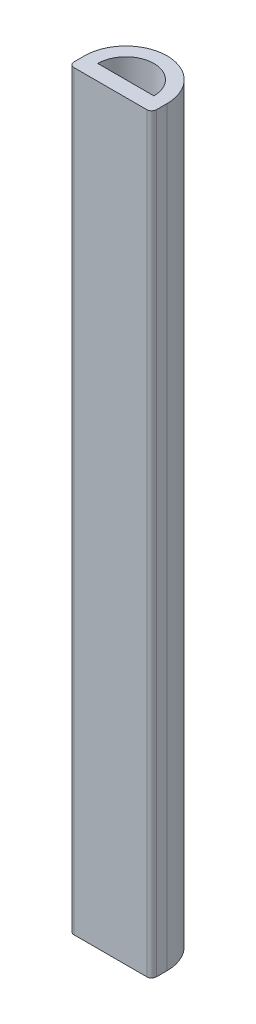
ISO-10303-21;
HEADER;
FILE_DESCRIPTION(('STEP AP214'),'2;1');
FILE_NAME('part.step','',(''),(''),'','','');
FILE_SCHEMA(('AUTOMOTIVE_DESIGN { 1 0 10303 214 1 1 1 1 }'));
ENDSEC;
DATA;
#1=APPLICATION_CONTEXT('core data for automotive mechanical design processes');
#2=APPLICATION_PROTOCOL_DEFINITION('international standard','automotive_design',2000,#1);
#3=PRODUCT_CONTEXT('',#1,'mechanical');
#4=PRODUCT('Part','Part','',(#3));
#5=PRODUCT_RELATED_PRODUCT_CATEGORY('part','',(#4));
#6=PRODUCT_DEFINITION_FORMATION('','',#4);
#7=PRODUCT_DEFINITION_CONTEXT('part definition',#1,'design');
#8=PRODUCT_DEFINITION('design','',#6,#7);
#9=PRODUCT_DEFINITION_SHAPE('','',#8);
#10=(LENGTH_UNIT() NAMED_UNIT(*) SI_UNIT(.MILLI.,.METRE.));
#11=(NAMED_UNIT(*) PLANE_ANGLE_UNIT() SI_UNIT($,.RADIAN.));
#12=(NAMED_UNIT(*) SI_UNIT($,.STERADIAN.) SOLID_ANGLE_UNIT());
#13=UNCERTAINTY_MEASURE_WITH_UNIT(LENGTH_MEASURE(1.E-05),#10,'distance_accuracy_value','');
#14=(GEOMETRIC_REPRESENTATION_CONTEXT(3) GLOBAL_UNCERTAINTY_ASSIGNED_CONTEXT((#13)) GLOBAL_UNIT_ASSIGNED_CONTEXT((#10,
#11,#12)) REPRESENTATION_CONTEXT('',''));
#15=CARTESIAN_POINT('',(0.,0.,0.));
#16=DIRECTION('',(0.,0.,1.));
#17=DIRECTION('',(1.,0.,0.));
#18=AXIS2_PLACEMENT_3D('',#15,#16,#17);
#19=CARTESIAN_POINT('',(0.,170.,0.));
#20=DIRECTION('',(0.,1.,0.));
#21=DIRECTION('',(0.,0.,1.));
#22=AXIS2_PLACEMENT_3D('',#19,#20,#21);
#23=PLANE('',#22);
#24=DIRECTION('',(0.,0.,1.));
#25=VECTOR('',#24,1.);
#26=CARTESIAN_POINT('',(-9.35,170.,0.));
#27=LINE('',#26,#25);
#28=CARTESIAN_POINT('',(-9.35,170.,0.));
#29=VERTEX_POINT('',#28);
#30=CARTESIAN_POINT('',(-9.35,170.,2.4));
#31=VERTEX_POINT('',#30);
#32=EDGE_CURVE('E126',#29,#31,#27,.T.);
#33=ORIENTED_EDGE('',*,*,#32,.T.);
#34=CARTESIAN_POINT('',(-8.25,170.,2.4));
#35=DIRECTION('',(0.,1.,0.));
#36=DIRECTION('',(0.,0.,1.));
#37=AXIS2_PLACEMENT_3D('',#34,#35,#36);
#38=CIRCLE('',#37,1.1);
#39=CARTESIAN_POINT('',(-8.25,170.,3.5));
#40=VERTEX_POINT('',#39);
#41=EDGE_CURVE('E40',#31,#40,#38,.T.);
#42=ORIENTED_EDGE('',*,*,#41,.T.);
#43=DIRECTION('',(1.,0.,0.));
#44=VECTOR('',#43,1.);
#45=CARTESIAN_POINT('',(-9.35,170.,3.5));
#46=LINE('',#45,#44);
#47=CARTESIAN_POINT('',(8.25,170.,3.5));
#48=VERTEX_POINT('',#47);
#49=EDGE_CURVE('E129',#40,#48,#46,.T.);
#50=ORIENTED_EDGE('',*,*,#49,.T.);
#51=CARTESIAN_POINT('',(8.25,170.,2.4));
#52=DIRECTION('',(0.,1.,0.));
#53=DIRECTION('',(0.,0.,1.));
#54=AXIS2_PLACEMENT_3D('',#51,#52,#53);
#55=CIRCLE('',#54,1.1);
#56=CARTESIAN_POINT('',(9.35,170.,2.4));
#57=VERTEX_POINT('',#56);
#58=EDGE_CURVE('E47',#48,#57,#55,.T.);
#59=ORIENTED_EDGE('',*,*,#58,.T.);
#60=DIRECTION('',(0.,0.,-1.));
#61=VECTOR('',#60,1.);
#62=CARTESIAN_POINT('',(9.35,170.,3.5));
#63=LINE('',#62,#61);
#64=CARTESIAN_POINT('',(9.35,170.,0.));
#65=VERTEX_POINT('',#64);
#66=EDGE_CURVE('E131',#57,#65,#63,.T.);
#67=ORIENTED_EDGE('',*,*,#66,.T.);
#68=CARTESIAN_POINT('',(0.,170.,0.));
#69=DIRECTION('',(0.,1.,0.));
#70=DIRECTION('',(0.,0.,1.));
#71=AXIS2_PLACEMENT_3D('',#68,#69,#70);
#72=CIRCLE('',#71,9.35);
#73=EDGE_CURVE('E123',#65,#29,#72,.T.);
#74=ORIENTED_EDGE('',*,*,#73,.T.);
#75=EDGE_LOOP('',(#33,#42,#50,#59,#67,#74));
#76=FACE_BOUND('',#75,.T.);
#77=DIRECTION('',(1.,0.,0.));
#78=VECTOR('',#77,1.);
#79=CARTESIAN_POINT('',(-6.35,170.,0.));
#80=LINE('',#79,#78);
#81=CARTESIAN_POINT('',(-6.35,170.,0.));
#82=VERTEX_POINT('',#81);
#83=CARTESIAN_POINT('',(6.35,170.,0.));
#84=VERTEX_POINT('',#83);
#85=EDGE_CURVE('E99',#82,#84,#80,.T.);
#86=ORIENTED_EDGE('',*,*,#85,.F.);
#87=CARTESIAN_POINT('',(0.,170.,0.));
#88=DIRECTION('',(0.,1.,0.));
#89=DIRECTION('',(0.,0.,1.));
#90=AXIS2_PLACEMENT_3D('',#87,#88,#89);
#91=CIRCLE('',#90,6.35);
#92=EDGE_CURVE('E109',#84,#82,#91,.T.);
#93=ORIENTED_EDGE('',*,*,#92,.F.);
#94=EDGE_LOOP('',(#86,#93));
#95=FACE_BOUND('',#94,.T.);
#96=ADVANCED_FACE('F32',(#76,#95),#23,.T.);
#97=CARTESIAN_POINT('',(0.,0.,0.));
#98=DIRECTION('',(0.,1.,0.));
#99=DIRECTION('',(0.,0.,1.));
#100=AXIS2_PLACEMENT_3D('',#97,#98,#99);
#101=PLANE('',#100);
#102=DIRECTION('',(1.,0.,0.));
#103=VECTOR('',#102,1.);
#104=CARTESIAN_POINT('',(-9.35,0.,3.5));
#105=LINE('',#104,#103);
#106=CARTESIAN_POINT('',(-8.25,0.,3.5));
#107=VERTEX_POINT('',#106);
#108=CARTESIAN_POINT('',(8.25,0.,3.5));
#109=VERTEX_POINT('',#108);
#110=EDGE_CURVE('E138',#107,#109,#105,.T.);
#111=ORIENTED_EDGE('',*,*,#110,.F.);
#112=CARTESIAN_POINT('',(-8.25,0.,2.4));
#113=DIRECTION('',(0.,1.,0.));
#114=DIRECTION('',(0.,0.,1.));
#115=AXIS2_PLACEMENT_3D('',#112,#113,#114);
#116=CIRCLE('',#115,1.1);
#117=CARTESIAN_POINT('',(-9.35,0.,2.4));
#118=VERTEX_POINT('',#117);
#119=EDGE_CURVE('E154',#107,#118,#116,.F.);
#120=ORIENTED_EDGE('',*,*,#119,.T.);
#121=DIRECTION('',(0.,0.,1.));
#122=VECTOR('',#121,1.);
#123=CARTESIAN_POINT('',(-9.35,0.,0.));
#124=LINE('',#123,#122);
#125=CARTESIAN_POINT('',(-9.35,0.,0.));
#126=VERTEX_POINT('',#125);
#127=EDGE_CURVE('E136',#126,#118,#124,.T.);
#128=ORIENTED_EDGE('',*,*,#127,.F.);
#129=CARTESIAN_POINT('',(0.,0.,0.));
#130=DIRECTION('',(0.,1.,0.));
#131=DIRECTION('',(0.,0.,1.));
#132=AXIS2_PLACEMENT_3D('',#129,#130,#131);
#133=CIRCLE('',#132,9.35);
#134=CARTESIAN_POINT('',(9.35,0.,0.));
#135=VERTEX_POINT('',#134);
#136=EDGE_CURVE('E122',#135,#126,#133,.T.);
#137=ORIENTED_EDGE('',*,*,#136,.F.);
#138=DIRECTION('',(0.,0.,-1.));
#139=VECTOR('',#138,1.);
#140=CARTESIAN_POINT('',(9.35,0.,3.5));
#141=LINE('',#140,#139);
#142=CARTESIAN_POINT('',(9.35,0.,2.4));
#143=VERTEX_POINT('',#142);
#144=EDGE_CURVE('E127',#143,#135,#141,.T.);
#145=ORIENTED_EDGE('',*,*,#144,.F.);
#146=CARTESIAN_POINT('',(8.25,0.,2.4));
#147=DIRECTION('',(0.,1.,0.));
#148=DIRECTION('',(0.,0.,1.));
#149=AXIS2_PLACEMENT_3D('',#146,#147,#148);
#150=CIRCLE('',#149,1.1);
#151=EDGE_CURVE('E152',#143,#109,#150,.F.);
#152=ORIENTED_EDGE('',*,*,#151,.T.);
#153=EDGE_LOOP('',(#111,#120,#128,#137,#145,#152));
#154=FACE_BOUND('',#153,.T.);
#155=CARTESIAN_POINT('',(0.,0.,0.));
#156=DIRECTION('',(0.,1.,0.));
#157=DIRECTION('',(0.,0.,1.));
#158=AXIS2_PLACEMENT_3D('',#155,#156,#157);
#159=CIRCLE('',#158,6.35);
#160=CARTESIAN_POINT('',(6.35,0.,0.));
#161=VERTEX_POINT('',#160);
#162=CARTESIAN_POINT('',(-6.35,0.,0.));
#163=VERTEX_POINT('',#162);
#164=EDGE_CURVE('E114',#161,#163,#159,.T.);
#165=ORIENTED_EDGE('',*,*,#164,.T.);
#166=DIRECTION('',(1.,0.,0.));
#167=VECTOR('',#166,1.);
#168=CARTESIAN_POINT('',(-6.35,0.,0.));
#169=LINE('',#168,#167);
#170=EDGE_CURVE('E116',#163,#161,#169,.T.);
#171=ORIENTED_EDGE('',*,*,#170,.T.);
#172=EDGE_LOOP('',(#165,#171));
#173=FACE_BOUND('',#172,.T.);
#174=ADVANCED_FACE('F167',(#154,#173),#101,.F.);
#175=CARTESIAN_POINT('',(0.,170.,0.));
#176=DIRECTION('',(0.,-1.,0.));
#177=DIRECTION('',(0.,0.,-1.));
#178=AXIS2_PLACEMENT_3D('',#175,#176,#177);
#179=CYLINDRICAL_SURFACE('',#178,9.35);
#180=ORIENTED_EDGE('',*,*,#136,.T.);
#181=DIRECTION('',(0.,-1.,0.));
#182=VECTOR('',#181,1.);
#183=CARTESIAN_POINT('',(-9.35,170.,0.));
#184=LINE('',#183,#182);
#185=EDGE_CURVE('E144',#29,#126,#184,.T.);
#186=ORIENTED_EDGE('',*,*,#185,.F.);
#187=ORIENTED_EDGE('',*,*,#73,.F.);
#188=DIRECTION('',(0.,-1.,0.));
#189=VECTOR('',#188,1.);
#190=CARTESIAN_POINT('',(9.35,170.,0.));
#191=LINE('',#190,#189);
#192=EDGE_CURVE('E133',#65,#135,#191,.T.);
#193=ORIENTED_EDGE('',*,*,#192,.T.);
#194=EDGE_LOOP('',(#180,#186,#187,#193));
#195=FACE_BOUND('',#194,.T.);
#196=ADVANCED_FACE('F174',(#195),#179,.T.);
#197=CARTESIAN_POINT('',(-9.35,170.,0.));
#198=DIRECTION('',(1.,0.,0.));
#199=DIRECTION('',(0.,0.,-1.));
#200=AXIS2_PLACEMENT_3D('',#197,#198,#199);
#201=PLANE('',#200);
#202=ORIENTED_EDGE('',*,*,#127,.T.);
#203=DIRECTION('',(0.,-1.,0.));
#204=VECTOR('',#203,1.);
#205=CARTESIAN_POINT('',(-9.35,170.,2.4));
#206=LINE('',#205,#204);
#207=EDGE_CURVE('E55',#118,#31,#206,.F.);
#208=ORIENTED_EDGE('',*,*,#207,.T.);
#209=ORIENTED_EDGE('',*,*,#32,.F.);
#210=ORIENTED_EDGE('',*,*,#185,.T.);
#211=EDGE_LOOP('',(#202,#208,#209,#210));
#212=FACE_BOUND('',#211,.T.);
#213=ADVANCED_FACE('F170',(#212),#201,.F.);
#214=CARTESIAN_POINT('',(-9.35,170.,3.5));
#215=DIRECTION('',(0.,0.,-1.));
#216=DIRECTION('',(-1.,0.,0.));
#217=AXIS2_PLACEMENT_3D('',#214,#215,#216);
#218=PLANE('',#217);
#219=ORIENTED_EDGE('',*,*,#49,.F.);
#220=DIRECTION('',(0.,-1.,0.));
#221=VECTOR('',#220,1.);
#222=CARTESIAN_POINT('',(-8.25,170.,3.5));
#223=LINE('',#222,#221);
#224=EDGE_CURVE('E149',#40,#107,#223,.T.);
#225=ORIENTED_EDGE('',*,*,#224,.T.);
#226=ORIENTED_EDGE('',*,*,#110,.T.);
#227=DIRECTION('',(0.,-1.,0.));
#228=VECTOR('',#227,1.);
#229=CARTESIAN_POINT('',(8.25,170.,3.5));
#230=LINE('',#229,#228);
#231=EDGE_CURVE('E147',#109,#48,#230,.F.);
#232=ORIENTED_EDGE('',*,*,#231,.T.);
#233=EDGE_LOOP('',(#219,#225,#226,#232));
#234=FACE_BOUND('',#233,.T.);
#235=ADVANCED_FACE('F162',(#234),#218,.F.);
#236=CARTESIAN_POINT('',(9.35,170.,3.5));
#237=DIRECTION('',(-1.,0.,0.));
#238=DIRECTION('',(0.,0.,1.));
#239=AXIS2_PLACEMENT_3D('',#236,#237,#238);
#240=PLANE('',#239);
#241=ORIENTED_EDGE('',*,*,#66,.F.);
#242=DIRECTION('',(0.,-1.,0.));
#243=VECTOR('',#242,1.);
#244=CARTESIAN_POINT('',(9.35,170.,2.4));
#245=LINE('',#244,#243);
#246=EDGE_CURVE('E11',#57,#143,#245,.T.);
#247=ORIENTED_EDGE('',*,*,#246,.T.);
#248=ORIENTED_EDGE('',*,*,#144,.T.);
#249=ORIENTED_EDGE('',*,*,#192,.F.);
#250=EDGE_LOOP('',(#241,#247,#248,#249));
#251=FACE_BOUND('',#250,.T.);
#252=ADVANCED_FACE('F178',(#251),#240,.F.);
#253=CARTESIAN_POINT('',(0.,170.,0.));
#254=DIRECTION('',(0.,-1.,0.));
#255=DIRECTION('',(0.,0.,-1.));
#256=AXIS2_PLACEMENT_3D('',#253,#254,#255);
#257=CYLINDRICAL_SURFACE('',#256,6.35);
#258=ORIENTED_EDGE('',*,*,#164,.F.);
#259=DIRECTION('',(0.,-1.,0.));
#260=VECTOR('',#259,1.);
#261=CARTESIAN_POINT('',(6.35,170.,0.));
#262=LINE('',#261,#260);
#263=EDGE_CURVE('E102',#84,#161,#262,.T.);
#264=ORIENTED_EDGE('',*,*,#263,.F.);
#265=ORIENTED_EDGE('',*,*,#92,.T.);
#266=DIRECTION('',(0.,-1.,0.));
#267=VECTOR('',#266,1.);
#268=CARTESIAN_POINT('',(-6.35,170.,0.));
#269=LINE('',#268,#267);
#270=EDGE_CURVE('E105',#82,#163,#269,.T.);
#271=ORIENTED_EDGE('',*,*,#270,.T.);
#272=EDGE_LOOP('',(#258,#264,#265,#271));
#273=FACE_BOUND('',#272,.T.);
#274=ADVANCED_FACE('F112',(#273),#257,.F.);
#275=CARTESIAN_POINT('',(-6.35,170.,0.));
#276=DIRECTION('',(0.,0.,-1.));
#277=DIRECTION('',(-1.,0.,0.));
#278=AXIS2_PLACEMENT_3D('',#275,#276,#277);
#279=PLANE('',#278);
#280=ORIENTED_EDGE('',*,*,#170,.F.);
#281=ORIENTED_EDGE('',*,*,#270,.F.);
#282=ORIENTED_EDGE('',*,*,#85,.T.);
#283=ORIENTED_EDGE('',*,*,#263,.T.);
#284=EDGE_LOOP('',(#280,#281,#282,#283));
#285=FACE_BOUND('',#284,.T.);
#286=ADVANCED_FACE('F101',(#285),#279,.T.);
#287=CARTESIAN_POINT('',(-8.25,170.,2.4));
#288=DIRECTION('',(0.,-1.,0.));
#289=DIRECTION('',(0.,0.,-1.));
#290=AXIS2_PLACEMENT_3D('',#287,#288,#289);
#291=CYLINDRICAL_SURFACE('',#290,1.1);
#292=ORIENTED_EDGE('',*,*,#41,.F.);
#293=ORIENTED_EDGE('',*,*,#207,.F.);
#294=ORIENTED_EDGE('',*,*,#119,.F.);
#295=ORIENTED_EDGE('',*,*,#224,.F.);
#296=EDGE_LOOP('',(#292,#293,#294,#295));
#297=FACE_BOUND('',#296,.T.);
#298=ADVANCED_FACE('F165',(#297),#291,.T.);
#299=CARTESIAN_POINT('',(8.25,170.,2.4));
#300=DIRECTION('',(0.,-1.,0.));
#301=DIRECTION('',(0.,0.,-1.));
#302=AXIS2_PLACEMENT_3D('',#299,#300,#301);
#303=CYLINDRICAL_SURFACE('',#302,1.1);
#304=ORIENTED_EDGE('',*,*,#58,.F.);
#305=ORIENTED_EDGE('',*,*,#231,.F.);
#306=ORIENTED_EDGE('',*,*,#151,.F.);
#307=ORIENTED_EDGE('',*,*,#246,.F.);
#308=EDGE_LOOP('',(#304,#305,#306,#307));
#309=FACE_BOUND('',#308,.T.);
#310=ADVANCED_FACE('F34',(#309),#303,.T.);
#311=CLOSED_SHELL('',(#96,#174,#196,#213,#235,#252,#274,#286,#298,#310));
#312=MANIFOLD_SOLID_BREP('B2',#311);
#313=ADVANCED_BREP_SHAPE_REPRESENTATION('',(#18,#312),#14);
#314=SHAPE_DEFINITION_REPRESENTATION(#9,#313);
ENDSEC;
END-ISO-10303-21;
